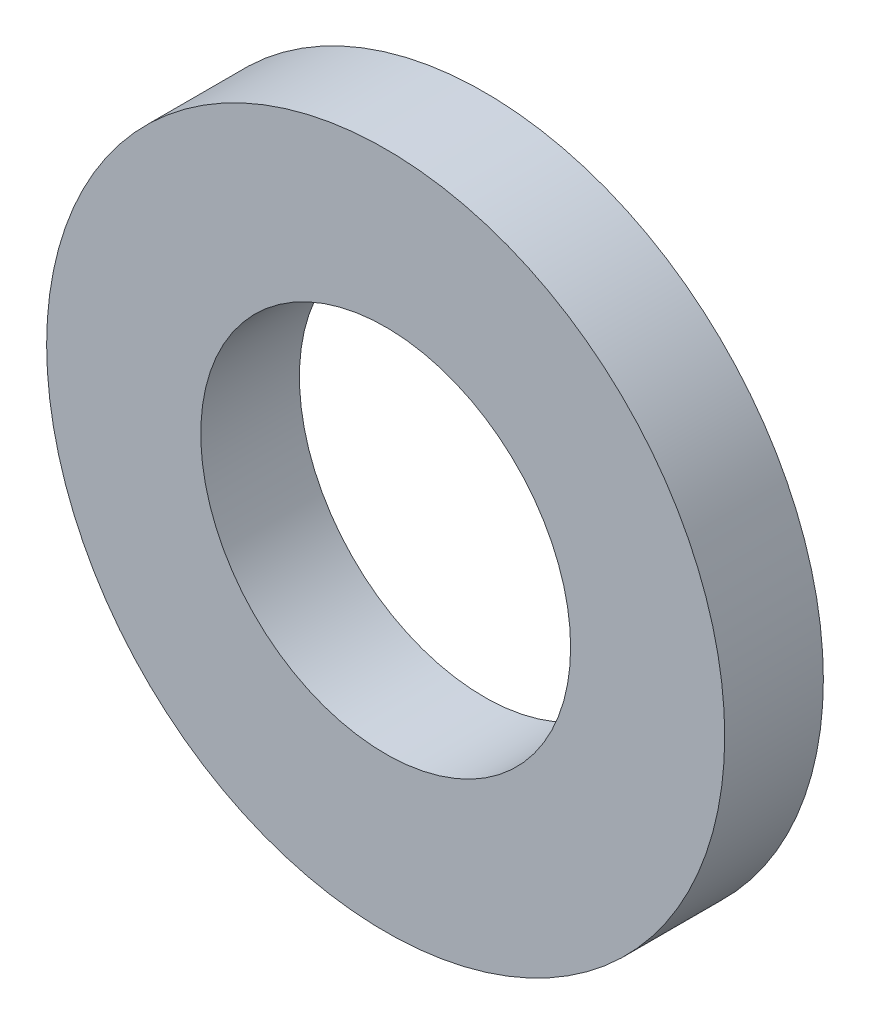
ISO-10303-21;
HEADER;
FILE_DESCRIPTION(('STEP AP214'),'2;1');
FILE_NAME('part.step','',(''),(''),'','','');
FILE_SCHEMA(('AUTOMOTIVE_DESIGN { 1 0 10303 214 1 1 1 1 }'));
ENDSEC;
DATA;
#1=APPLICATION_CONTEXT('core data for automotive mechanical design processes');
#2=APPLICATION_PROTOCOL_DEFINITION('international standard','automotive_design',2000,#1);
#3=PRODUCT_CONTEXT('',#1,'mechanical');
#4=PRODUCT('Part','Part','',(#3));
#5=PRODUCT_RELATED_PRODUCT_CATEGORY('part','',(#4));
#6=PRODUCT_DEFINITION_FORMATION('','',#4);
#7=PRODUCT_DEFINITION_CONTEXT('part definition',#1,'design');
#8=PRODUCT_DEFINITION('design','',#6,#7);
#9=PRODUCT_DEFINITION_SHAPE('','',#8);
#10=(LENGTH_UNIT() NAMED_UNIT(*) SI_UNIT(.MILLI.,.METRE.));
#11=(NAMED_UNIT(*) PLANE_ANGLE_UNIT() SI_UNIT($,.RADIAN.));
#12=(NAMED_UNIT(*) SI_UNIT($,.STERADIAN.) SOLID_ANGLE_UNIT());
#13=UNCERTAINTY_MEASURE_WITH_UNIT(LENGTH_MEASURE(1.E-05),#10,'distance_accuracy_value','');
#14=(GEOMETRIC_REPRESENTATION_CONTEXT(3) GLOBAL_UNCERTAINTY_ASSIGNED_CONTEXT((#13)) GLOBAL_UNIT_ASSIGNED_CONTEXT((#10,
#11,#12)) REPRESENTATION_CONTEXT('',''));
#15=CARTESIAN_POINT('',(0.,0.,0.));
#16=DIRECTION('',(0.,0.,1.));
#17=DIRECTION('',(1.,0.,0.));
#18=AXIS2_PLACEMENT_3D('',#15,#16,#17);
#19=CARTESIAN_POINT('',(0.,0.,1.6));
#20=DIRECTION('',(0.,0.,1.));
#21=DIRECTION('',(1.,0.,0.));
#22=AXIS2_PLACEMENT_3D('',#19,#20,#21);
#23=PLANE('',#22);
#24=CARTESIAN_POINT('',(0.,0.,1.6));
#25=DIRECTION('',(0.,0.,1.));
#26=DIRECTION('',(1.,0.,0.));
#27=AXIS2_PLACEMENT_3D('',#24,#25,#26);
#28=CIRCLE('',#27,5.5);
#29=CARTESIAN_POINT('',(5.5,0.,1.6));
#30=VERTEX_POINT('',#29);
#31=EDGE_CURVE('E10',#30,#30,#28,.T.);
#32=ORIENTED_EDGE('',*,*,#31,.T.);
#33=EDGE_LOOP('',(#32));
#34=FACE_BOUND('',#33,.T.);
#35=CARTESIAN_POINT('',(0.,0.,1.6));
#36=DIRECTION('',(0.,0.,1.));
#37=DIRECTION('',(1.,0.,0.));
#38=AXIS2_PLACEMENT_3D('',#35,#36,#37);
#39=CIRCLE('',#38,3.);
#40=CARTESIAN_POINT('',(3.,0.,1.6));
#41=VERTEX_POINT('',#40);
#42=EDGE_CURVE('E43',#41,#41,#39,.T.);
#43=ORIENTED_EDGE('',*,*,#42,.F.);
#44=EDGE_LOOP('',(#43));
#45=FACE_BOUND('',#44,.T.);
#46=ADVANCED_FACE('F32',(#34,#45),#23,.T.);
#47=CARTESIAN_POINT('',(0.,0.,0.));
#48=DIRECTION('',(0.,0.,1.));
#49=DIRECTION('',(1.,0.,0.));
#50=AXIS2_PLACEMENT_3D('',#47,#48,#49);
#51=PLANE('',#50);
#52=CARTESIAN_POINT('',(0.,0.,0.));
#53=DIRECTION('',(0.,0.,1.));
#54=DIRECTION('',(1.,0.,0.));
#55=AXIS2_PLACEMENT_3D('',#52,#53,#54);
#56=CIRCLE('',#55,5.5);
#57=CARTESIAN_POINT('',(5.5,0.,0.));
#58=VERTEX_POINT('',#57);
#59=EDGE_CURVE('E36',#58,#58,#56,.T.);
#60=ORIENTED_EDGE('',*,*,#59,.F.);
#61=EDGE_LOOP('',(#60));
#62=FACE_BOUND('',#61,.T.);
#63=CARTESIAN_POINT('',(0.,0.,0.));
#64=DIRECTION('',(0.,0.,1.));
#65=DIRECTION('',(1.,0.,0.));
#66=AXIS2_PLACEMENT_3D('',#63,#64,#65);
#67=CIRCLE('',#66,3.);
#68=CARTESIAN_POINT('',(3.,0.,0.));
#69=VERTEX_POINT('',#68);
#70=EDGE_CURVE('E45',#69,#69,#67,.T.);
#71=ORIENTED_EDGE('',*,*,#70,.T.);
#72=EDGE_LOOP('',(#71));
#73=FACE_BOUND('',#72,.T.);
#74=ADVANCED_FACE('F55',(#62,#73),#51,.F.);
#75=CARTESIAN_POINT('',(0.,0.,1.6));
#76=DIRECTION('',(0.,0.,-1.));
#77=DIRECTION('',(-1.,0.,0.));
#78=AXIS2_PLACEMENT_3D('',#75,#76,#77);
#79=CYLINDRICAL_SURFACE('',#78,5.5);
#80=ORIENTED_EDGE('',*,*,#31,.F.);
#81=EDGE_LOOP('',(#80));
#82=FACE_BOUND('',#81,.T.);
#83=ORIENTED_EDGE('',*,*,#59,.T.);
#84=EDGE_LOOP('',(#83));
#85=FACE_BOUND('',#84,.T.);
#86=ADVANCED_FACE('F34',(#82,#85),#79,.T.);
#87=CARTESIAN_POINT('',(0.,0.,1.6));
#88=DIRECTION('',(0.,0.,-1.));
#89=DIRECTION('',(-1.,0.,0.));
#90=AXIS2_PLACEMENT_3D('',#87,#88,#89);
#91=CYLINDRICAL_SURFACE('',#90,3.);
#92=ORIENTED_EDGE('',*,*,#42,.T.);
#93=EDGE_LOOP('',(#92));
#94=FACE_BOUND('',#93,.T.);
#95=ORIENTED_EDGE('',*,*,#70,.F.);
#96=EDGE_LOOP('',(#95));
#97=FACE_BOUND('',#96,.T.);
#98=ADVANCED_FACE('F51',(#94,#97),#91,.F.);
#99=CLOSED_SHELL('',(#46,#74,#86,#98));
#100=MANIFOLD_SOLID_BREP('B2',#99);
#101=ADVANCED_BREP_SHAPE_REPRESENTATION('',(#18,#100),#14);
#102=SHAPE_DEFINITION_REPRESENTATION(#9,#101);
ENDSEC;
END-ISO-10303-21;
